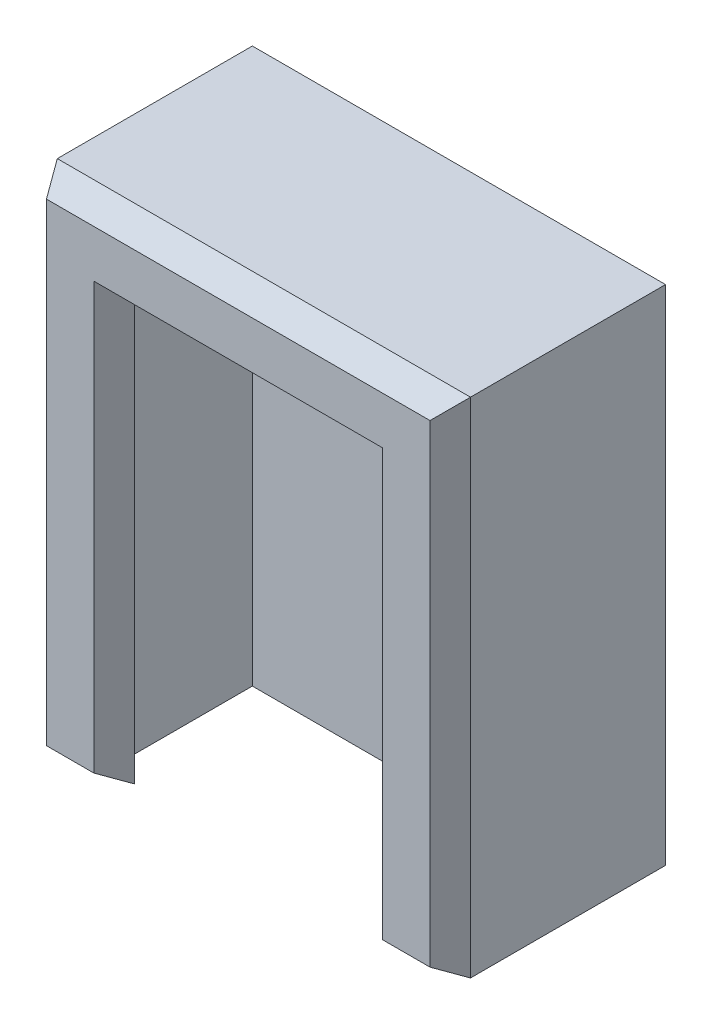
ISO-10303-21;
HEADER;
FILE_DESCRIPTION(('STEP AP214'),'2;1');
FILE_NAME('part.step','',(''),(''),'','','');
FILE_SCHEMA(('AUTOMOTIVE_DESIGN { 1 0 10303 214 1 1 1 1 }'));
ENDSEC;
DATA;
#1=APPLICATION_CONTEXT('core data for automotive mechanical design processes');
#2=APPLICATION_PROTOCOL_DEFINITION('international standard','automotive_design',2000,#1);
#3=PRODUCT_CONTEXT('',#1,'mechanical');
#4=PRODUCT('Part','Part','',(#3));
#5=PRODUCT_RELATED_PRODUCT_CATEGORY('part','',(#4));
#6=PRODUCT_DEFINITION_FORMATION('','',#4);
#7=PRODUCT_DEFINITION_CONTEXT('part definition',#1,'design');
#8=PRODUCT_DEFINITION('design','',#6,#7);
#9=PRODUCT_DEFINITION_SHAPE('','',#8);
#10=(LENGTH_UNIT() NAMED_UNIT(*) SI_UNIT(.MILLI.,.METRE.));
#11=(NAMED_UNIT(*) PLANE_ANGLE_UNIT() SI_UNIT($,.RADIAN.));
#12=(NAMED_UNIT(*) SI_UNIT($,.STERADIAN.) SOLID_ANGLE_UNIT());
#13=UNCERTAINTY_MEASURE_WITH_UNIT(LENGTH_MEASURE(1.E-05),#10,'distance_accuracy_value','');
#14=(GEOMETRIC_REPRESENTATION_CONTEXT(3) GLOBAL_UNCERTAINTY_ASSIGNED_CONTEXT((#13)) GLOBAL_UNIT_ASSIGNED_CONTEXT((#10,
#11,#12)) REPRESENTATION_CONTEXT('',''));
#15=CARTESIAN_POINT('',(0.,0.,0.));
#16=DIRECTION('',(0.,0.,1.));
#17=DIRECTION('',(1.,0.,0.));
#18=AXIS2_PLACEMENT_3D('',#15,#16,#17);
#19=CARTESIAN_POINT('',(0.,17.6,5.6));
#20=DIRECTION('',(0.,-1.,0.));
#21=DIRECTION('',(0.,0.,-1.));
#22=AXIS2_PLACEMENT_3D('',#19,#20,#21);
#23=PLANE('',#22);
#24=DIRECTION('',(0.,0.,-1.));
#25=VECTOR('',#24,1.);
#26=CARTESIAN_POINT('',(2.,17.6,5.6));
#27=LINE('',#26,#25);
#28=CARTESIAN_POINT('',(2.,17.6,5.6));
#29=VERTEX_POINT('',#28);
#30=CARTESIAN_POINT('',(2.,17.6,-2.));
#31=VERTEX_POINT('',#30);
#32=EDGE_CURVE('E106',#29,#31,#27,.T.);
#33=ORIENTED_EDGE('',*,*,#32,.T.);
#34=DIRECTION('',(-1.,0.,0.));
#35=VECTOR('',#34,1.);
#36=CARTESIAN_POINT('',(0.,17.6,-2.));
#37=LINE('',#36,#35);
#38=CARTESIAN_POINT('',(-14.1,17.6,-2.));
#39=VERTEX_POINT('',#38);
#40=EDGE_CURVE('E156',#31,#39,#37,.T.);
#41=ORIENTED_EDGE('',*,*,#40,.T.);
#42=DIRECTION('',(0.,0.,-1.));
#43=VECTOR('',#42,1.);
#44=CARTESIAN_POINT('',(-14.1,17.6,5.6));
#45=LINE('',#44,#43);
#46=CARTESIAN_POINT('',(-14.1,17.6,5.6));
#47=VERTEX_POINT('',#46);
#48=EDGE_CURVE('E11',#47,#39,#45,.T.);
#49=ORIENTED_EDGE('',*,*,#48,.F.);
#50=DIRECTION('',(-1.,0.,0.));
#51=VECTOR('',#50,1.);
#52=CARTESIAN_POINT('',(0.,17.6,5.6));
#53=LINE('',#52,#51);
#54=EDGE_CURVE('E98',#29,#47,#53,.T.);
#55=ORIENTED_EDGE('',*,*,#54,.F.);
#56=EDGE_LOOP('',(#33,#41,#49,#55));
#57=FACE_BOUND('',#56,.T.);
#58=ADVANCED_FACE('F41',(#57),#23,.F.);
#59=CARTESIAN_POINT('',(-14.1,0.,5.6));
#60=DIRECTION('',(1.,0.,0.));
#61=DIRECTION('',(0.,0.,-1.));
#62=AXIS2_PLACEMENT_3D('',#59,#60,#61);
#63=PLANE('',#62);
#64=ORIENTED_EDGE('',*,*,#48,.T.);
#65=DIRECTION('',(0.,-1.,0.));
#66=VECTOR('',#65,1.);
#67=CARTESIAN_POINT('',(-14.1,0.,-2.));
#68=LINE('',#67,#66);
#69=CARTESIAN_POINT('',(-14.1,-2.,-2.));
#70=VERTEX_POINT('',#69);
#71=EDGE_CURVE('E147',#39,#70,#68,.T.);
#72=ORIENTED_EDGE('',*,*,#71,.T.);
#73=DIRECTION('',(0.,0.,-1.));
#74=VECTOR('',#73,1.);
#75=CARTESIAN_POINT('',(-14.1,-2.,5.6));
#76=LINE('',#75,#74);
#77=CARTESIAN_POINT('',(-14.1,-2.,5.6));
#78=VERTEX_POINT('',#77);
#79=EDGE_CURVE('E50',#78,#70,#76,.T.);
#80=ORIENTED_EDGE('',*,*,#79,.F.);
#81=DIRECTION('',(0.,-1.,0.));
#82=VECTOR('',#81,1.);
#83=CARTESIAN_POINT('',(-14.1,0.,5.6));
#84=LINE('',#83,#82);
#85=EDGE_CURVE('E102',#47,#78,#84,.T.);
#86=ORIENTED_EDGE('',*,*,#85,.F.);
#87=EDGE_LOOP('',(#64,#72,#80,#86));
#88=FACE_BOUND('',#87,.T.);
#89=ADVANCED_FACE('F152',(#88),#63,.F.);
#90=CARTESIAN_POINT('',(-12.1,0.,5.6));
#91=DIRECTION('',(1.,0.,0.));
#92=DIRECTION('',(0.,0.,-1.));
#93=AXIS2_PLACEMENT_3D('',#90,#91,#92);
#94=PLANE('',#93);
#95=DIRECTION('',(0.,-1.,0.));
#96=VECTOR('',#95,1.);
#97=CARTESIAN_POINT('',(-12.1,0.,0.));
#98=LINE('',#97,#96);
#99=CARTESIAN_POINT('',(-12.1,15.6,0.));
#100=VERTEX_POINT('',#99);
#101=CARTESIAN_POINT('',(-12.1,-2.,0.));
#102=VERTEX_POINT('',#101);
#103=EDGE_CURVE('E92',#100,#102,#98,.T.);
#104=ORIENTED_EDGE('',*,*,#103,.F.);
#105=DIRECTION('',(0.,0.,-1.));
#106=VECTOR('',#105,1.);
#107=CARTESIAN_POINT('',(-12.1,15.6,5.6));
#108=LINE('',#107,#106);
#109=CARTESIAN_POINT('',(-12.1,15.6,5.6));
#110=VERTEX_POINT('',#109);
#111=EDGE_CURVE('E81',#110,#100,#108,.T.);
#112=ORIENTED_EDGE('',*,*,#111,.F.);
#113=DIRECTION('',(0.,-1.,0.));
#114=VECTOR('',#113,1.);
#115=CARTESIAN_POINT('',(-12.1,0.,5.6));
#116=LINE('',#115,#114);
#117=CARTESIAN_POINT('',(-12.1,-2.,5.6));
#118=VERTEX_POINT('',#117);
#119=EDGE_CURVE('E171',#110,#118,#116,.T.);
#120=ORIENTED_EDGE('',*,*,#119,.T.);
#121=DIRECTION('',(0.,0.,-1.));
#122=VECTOR('',#121,1.);
#123=CARTESIAN_POINT('',(-12.1,-2.,5.6));
#124=LINE('',#123,#122);
#125=EDGE_CURVE('E119',#118,#102,#124,.T.);
#126=ORIENTED_EDGE('',*,*,#125,.T.);
#127=EDGE_LOOP('',(#104,#112,#120,#126));
#128=FACE_BOUND('',#127,.T.);
#129=ADVANCED_FACE('F299',(#128),#94,.T.);
#130=CARTESIAN_POINT('',(0.,15.6,5.6));
#131=DIRECTION('',(0.,-1.,0.));
#132=DIRECTION('',(1.,0.,0.));
#133=AXIS2_PLACEMENT_3D('',#130,#131,#132);
#134=PLANE('',#133);
#135=DIRECTION('',(-1.,0.,0.));
#136=VECTOR('',#135,1.);
#137=CARTESIAN_POINT('',(0.,15.6,0.));
#138=LINE('',#137,#136);
#139=CARTESIAN_POINT('',(0.,15.6,0.));
#140=VERTEX_POINT('',#139);
#141=EDGE_CURVE('E85',#140,#100,#138,.T.);
#142=ORIENTED_EDGE('',*,*,#141,.F.);
#143=DIRECTION('',(0.,0.,-1.));
#144=VECTOR('',#143,1.);
#145=CARTESIAN_POINT('',(0.,15.6,5.6));
#146=LINE('',#145,#144);
#147=CARTESIAN_POINT('',(0.,15.6,5.6));
#148=VERTEX_POINT('',#147);
#149=EDGE_CURVE('E71',#148,#140,#146,.T.);
#150=ORIENTED_EDGE('',*,*,#149,.F.);
#151=DIRECTION('',(-1.,0.,0.));
#152=VECTOR('',#151,1.);
#153=CARTESIAN_POINT('',(0.,15.6,5.6));
#154=LINE('',#153,#152);
#155=EDGE_CURVE('E57',#148,#110,#154,.T.);
#156=ORIENTED_EDGE('',*,*,#155,.T.);
#157=ORIENTED_EDGE('',*,*,#111,.T.);
#158=EDGE_LOOP('',(#142,#150,#156,#157));
#159=FACE_BOUND('',#158,.T.);
#160=ADVANCED_FACE('F86',(#159),#134,.T.);
#161=CARTESIAN_POINT('',(0.,0.,5.6));
#162=DIRECTION('',(-1.,0.,0.));
#163=DIRECTION('',(0.,0.,1.));
#164=AXIS2_PLACEMENT_3D('',#161,#162,#163);
#165=PLANE('',#164);
#166=DIRECTION('',(0.,1.,0.));
#167=VECTOR('',#166,1.);
#168=CARTESIAN_POINT('',(0.,0.,0.));
#169=LINE('',#168,#167);
#170=CARTESIAN_POINT('',(0.,-2.,0.));
#171=VERTEX_POINT('',#170);
#172=EDGE_CURVE('E76',#171,#140,#169,.T.);
#173=ORIENTED_EDGE('',*,*,#172,.F.);
#174=DIRECTION('',(0.,0.,-1.));
#175=VECTOR('',#174,1.);
#176=CARTESIAN_POINT('',(0.,-2.,5.6));
#177=LINE('',#176,#175);
#178=CARTESIAN_POINT('',(0.,-2.,5.6));
#179=VERTEX_POINT('',#178);
#180=EDGE_CURVE('E82',#179,#171,#177,.T.);
#181=ORIENTED_EDGE('',*,*,#180,.F.);
#182=DIRECTION('',(0.,1.,0.));
#183=VECTOR('',#182,1.);
#184=CARTESIAN_POINT('',(0.,0.,5.6));
#185=LINE('',#184,#183);
#186=EDGE_CURVE('E78',#179,#148,#185,.T.);
#187=ORIENTED_EDGE('',*,*,#186,.T.);
#188=ORIENTED_EDGE('',*,*,#149,.T.);
#189=EDGE_LOOP('',(#173,#181,#187,#188));
#190=FACE_BOUND('',#189,.T.);
#191=ADVANCED_FACE('F73',(#190),#165,.T.);
#192=CARTESIAN_POINT('',(0.,-2.,5.6));
#193=DIRECTION('',(0.,1.,0.));
#194=DIRECTION('',(0.,0.,1.));
#195=AXIS2_PLACEMENT_3D('',#192,#193,#194);
#196=PLANE('',#195);
#197=ORIENTED_EDGE('',*,*,#180,.T.);
#198=DIRECTION('',(1.,0.,0.));
#199=VECTOR('',#198,1.);
#200=CARTESIAN_POINT('',(0.,-2.,0.));
#201=LINE('',#200,#199);
#202=EDGE_CURVE('E96',#102,#171,#201,.T.);
#203=ORIENTED_EDGE('',*,*,#202,.F.);
#204=ORIENTED_EDGE('',*,*,#125,.F.);
#205=DIRECTION('',(1.,0.,0.));
#206=VECTOR('',#205,1.);
#207=CARTESIAN_POINT('',(0.,-2.,5.6));
#208=LINE('',#207,#206);
#209=EDGE_CURVE('E137',#78,#118,#208,.T.);
#210=ORIENTED_EDGE('',*,*,#209,.F.);
#211=ORIENTED_EDGE('',*,*,#79,.T.);
#212=DIRECTION('',(1.,0.,0.));
#213=VECTOR('',#212,1.);
#214=CARTESIAN_POINT('',(0.,-2.,-2.));
#215=LINE('',#214,#213);
#216=CARTESIAN_POINT('',(2.,-2.,-2.));
#217=VERTEX_POINT('',#216);
#218=EDGE_CURVE('E133',#70,#217,#215,.T.);
#219=ORIENTED_EDGE('',*,*,#218,.T.);
#220=DIRECTION('',(0.,0.,-1.));
#221=VECTOR('',#220,1.);
#222=CARTESIAN_POINT('',(2.,-2.,5.6));
#223=LINE('',#222,#221);
#224=CARTESIAN_POINT('',(2.,-2.,5.6));
#225=VERTEX_POINT('',#224);
#226=EDGE_CURVE('E110',#225,#217,#223,.T.);
#227=ORIENTED_EDGE('',*,*,#226,.F.);
#228=EDGE_CURVE('E172',#179,#225,#208,.T.);
#229=ORIENTED_EDGE('',*,*,#228,.F.);
#230=EDGE_LOOP('',(#197,#203,#204,#210,#211,#219,#227,#229));
#231=FACE_BOUND('',#230,.T.);
#232=ADVANCED_FACE('F130',(#231),#196,.F.);
#233=CARTESIAN_POINT('',(2.,0.,5.6));
#234=DIRECTION('',(-1.,0.,0.));
#235=DIRECTION('',(0.,0.,1.));
#236=AXIS2_PLACEMENT_3D('',#233,#234,#235);
#237=PLANE('',#236);
#238=ORIENTED_EDGE('',*,*,#226,.T.);
#239=DIRECTION('',(0.,1.,0.));
#240=VECTOR('',#239,1.);
#241=CARTESIAN_POINT('',(2.,0.,-2.));
#242=LINE('',#241,#240);
#243=EDGE_CURVE('E149',#217,#31,#242,.T.);
#244=ORIENTED_EDGE('',*,*,#243,.T.);
#245=ORIENTED_EDGE('',*,*,#32,.F.);
#246=DIRECTION('',(0.,1.,0.));
#247=VECTOR('',#246,1.);
#248=CARTESIAN_POINT('',(2.,0.,5.6));
#249=LINE('',#248,#247);
#250=EDGE_CURVE('E111',#225,#29,#249,.T.);
#251=ORIENTED_EDGE('',*,*,#250,.F.);
#252=EDGE_LOOP('',(#238,#244,#245,#251));
#253=FACE_BOUND('',#252,.T.);
#254=ADVANCED_FACE('F215',(#253),#237,.F.);
#255=CARTESIAN_POINT('',(0.,0.,-2.));
#256=DIRECTION('',(0.,0.,1.));
#257=DIRECTION('',(1.,0.,0.));
#258=AXIS2_PLACEMENT_3D('',#255,#256,#257);
#259=PLANE('',#258);
#260=ORIENTED_EDGE('',*,*,#218,.F.);
#261=ORIENTED_EDGE('',*,*,#71,.F.);
#262=ORIENTED_EDGE('',*,*,#40,.F.);
#263=ORIENTED_EDGE('',*,*,#243,.F.);
#264=EDGE_LOOP('',(#260,#261,#262,#263));
#265=FACE_BOUND('',#264,.T.);
#266=ADVANCED_FACE('F145',(#265),#259,.F.);
#267=CARTESIAN_POINT('',(0.,0.,0.));
#268=DIRECTION('',(0.,0.,1.));
#269=DIRECTION('',(1.,0.,0.));
#270=AXIS2_PLACEMENT_3D('',#267,#268,#269);
#271=PLANE('',#270);
#272=ORIENTED_EDGE('',*,*,#202,.T.);
#273=ORIENTED_EDGE('',*,*,#172,.T.);
#274=ORIENTED_EDGE('',*,*,#141,.T.);
#275=ORIENTED_EDGE('',*,*,#103,.T.);
#276=EDGE_LOOP('',(#272,#273,#274,#275));
#277=FACE_BOUND('',#276,.T.);
#278=ADVANCED_FACE('F94',(#277),#271,.T.);
#279=CARTESIAN_POINT('',(2.,0.,5.6));
#280=DIRECTION('',(0.866025403784438,0.,0.5));
#281=DIRECTION('',(0.5,0.,-0.866025403784438));
#282=AXIS2_PLACEMENT_3D('',#279,#280,#281);
#283=PLANE('',#282);
#284=ORIENTED_EDGE('',*,*,#250,.T.);
#285=DIRECTION('',(0.447213595499958,0.447213595499958,-0.774596669241483));
#286=VECTOR('',#285,1.);
#287=CARTESIAN_POINT('',(1.6,17.2,6.29282032302755));
#288=LINE('',#287,#286);
#289=CARTESIAN_POINT('',(1.42264973081037,17.0226497308104,6.6));
#290=VERTEX_POINT('',#289);
#291=EDGE_CURVE('E164',#290,#29,#288,.T.);
#292=ORIENTED_EDGE('',*,*,#291,.F.);
#293=DIRECTION('',(0.,-1.,0.));
#294=VECTOR('',#293,1.);
#295=CARTESIAN_POINT('',(1.42264973081037,0.,6.6));
#296=LINE('',#295,#294);
#297=CARTESIAN_POINT('',(1.42264973081037,-1.42264973081037,6.6));
#298=VERTEX_POINT('',#297);
#299=EDGE_CURVE('E209',#298,#290,#296,.F.);
#300=ORIENTED_EDGE('',*,*,#299,.F.);
#301=DIRECTION('',(0.447213595499958,-0.447213595499958,-0.774596669241483));
#302=VECTOR('',#301,1.);
#303=CARTESIAN_POINT('',(1.6,-1.6,6.29282032302755));
#304=LINE('',#303,#302);
#305=EDGE_CURVE('E198',#298,#225,#304,.T.);
#306=ORIENTED_EDGE('',*,*,#305,.T.);
#307=EDGE_LOOP('',(#284,#292,#300,#306));
#308=FACE_BOUND('',#307,.T.);
#309=ADVANCED_FACE('F207',(#308),#283,.T.);
#310=CARTESIAN_POINT('',(0.,17.6,5.6));
#311=DIRECTION('',(0.,0.866025403784438,0.5));
#312=DIRECTION('',(0.,-0.5,0.866025403784438));
#313=AXIS2_PLACEMENT_3D('',#310,#311,#312);
#314=PLANE('',#313);
#315=ORIENTED_EDGE('',*,*,#54,.T.);
#316=DIRECTION('',(-0.447213595499958,0.447213595499958,-0.774596669241483));
#317=VECTOR('',#316,1.);
#318=CARTESIAN_POINT('',(-10.58,14.08,11.6968188426425));
#319=LINE('',#318,#317);
#320=CARTESIAN_POINT('',(-13.5226497308104,17.0226497308104,6.6));
#321=VERTEX_POINT('',#320);
#322=EDGE_CURVE('E228',#321,#47,#319,.T.);
#323=ORIENTED_EDGE('',*,*,#322,.F.);
#324=DIRECTION('',(1.,0.,0.));
#325=VECTOR('',#324,1.);
#326=CARTESIAN_POINT('',(0.,17.0226497308104,6.6));
#327=LINE('',#326,#325);
#328=EDGE_CURVE('E249',#290,#321,#327,.F.);
#329=ORIENTED_EDGE('',*,*,#328,.F.);
#330=ORIENTED_EDGE('',*,*,#291,.T.);
#331=EDGE_LOOP('',(#315,#323,#329,#330));
#332=FACE_BOUND('',#331,.T.);
#333=ADVANCED_FACE('F225',(#332),#314,.T.);
#334=CARTESIAN_POINT('',(-14.1,0.,5.6));
#335=DIRECTION('',(-0.866025403784438,0.,0.5));
#336=DIRECTION('',(0.5,0.,0.866025403784438));
#337=AXIS2_PLACEMENT_3D('',#334,#335,#336);
#338=PLANE('',#337);
#339=ORIENTED_EDGE('',*,*,#85,.T.);
#340=DIRECTION('',(-0.447213595499958,-0.447213595499958,-0.774596669241483));
#341=VECTOR('',#340,1.);
#342=CARTESIAN_POINT('',(-11.28,0.820000000000003,10.4843832773442));
#343=LINE('',#342,#341);
#344=CARTESIAN_POINT('',(-13.5226497308104,-1.42264973081037,6.6));
#345=VERTEX_POINT('',#344);
#346=EDGE_CURVE('E238',#345,#78,#343,.T.);
#347=ORIENTED_EDGE('',*,*,#346,.F.);
#348=DIRECTION('',(0.,1.,0.));
#349=VECTOR('',#348,1.);
#350=CARTESIAN_POINT('',(-13.5226497308104,0.,6.6));
#351=LINE('',#350,#349);
#352=EDGE_CURVE('E236',#321,#345,#351,.F.);
#353=ORIENTED_EDGE('',*,*,#352,.F.);
#354=ORIENTED_EDGE('',*,*,#322,.T.);
#355=EDGE_LOOP('',(#339,#347,#353,#354));
#356=FACE_BOUND('',#355,.T.);
#357=ADVANCED_FACE('F232',(#356),#338,.T.);
#358=CARTESIAN_POINT('',(0.,-2.,5.6));
#359=DIRECTION('',(0.,-0.866025403784438,0.5));
#360=DIRECTION('',(0.,-0.5,-0.866025403784438));
#361=AXIS2_PLACEMENT_3D('',#358,#359,#360);
#362=PLANE('',#361);
#363=ORIENTED_EDGE('',*,*,#209,.T.);
#364=DIRECTION('',(1.,0.,0.));
#365=VECTOR('',#364,1.);
#366=CARTESIAN_POINT('',(0.,-2.,5.6));
#367=LINE('',#366,#365);
#368=CARTESIAN_POINT('',(-11.1,-2.,5.6));
#369=VERTEX_POINT('',#368);
#370=EDGE_CURVE('E297',#118,#369,#367,.T.);
#371=ORIENTED_EDGE('',*,*,#370,.T.);
#372=DIRECTION('',(-0.447213595499958,0.447213595499958,0.774596669241483));
#373=VECTOR('',#372,1.);
#374=CARTESIAN_POINT('',(-8.88,-4.22,1.75484720719709));
#375=LINE('',#374,#373);
#376=CARTESIAN_POINT('',(-11.6773502691896,-1.42264973081037,6.6));
#377=VERTEX_POINT('',#376);
#378=EDGE_CURVE('E243',#377,#369,#375,.F.);
#379=ORIENTED_EDGE('',*,*,#378,.F.);
#380=DIRECTION('',(-1.,0.,0.));
#381=VECTOR('',#380,1.);
#382=CARTESIAN_POINT('',(0.,-1.42264973081037,6.6));
#383=LINE('',#382,#381);
#384=EDGE_CURVE('E255',#345,#377,#383,.F.);
#385=ORIENTED_EDGE('',*,*,#384,.F.);
#386=ORIENTED_EDGE('',*,*,#346,.T.);
#387=EDGE_LOOP('',(#363,#371,#379,#385,#386));
#388=FACE_BOUND('',#387,.T.);
#389=ADVANCED_FACE('F384',(#388),#362,.T.);
#390=CARTESIAN_POINT('',(-11.1,0.,5.6));
#391=DIRECTION('',(0.866025403784438,0.,0.5));
#392=DIRECTION('',(0.5,0.,-0.866025403784438));
#393=AXIS2_PLACEMENT_3D('',#390,#391,#392);
#394=PLANE('',#393);
#395=DIRECTION('',(0.,-1.,0.));
#396=VECTOR('',#395,1.);
#397=CARTESIAN_POINT('',(-11.1,0.,5.6));
#398=LINE('',#397,#396);
#399=CARTESIAN_POINT('',(-11.1,14.6,5.6));
#400=VERTEX_POINT('',#399);
#401=EDGE_CURVE('E497',#400,#369,#398,.T.);
#402=ORIENTED_EDGE('',*,*,#401,.F.);
#403=DIRECTION('',(-0.447213595499958,0.447213595499958,0.774596669241483));
#404=VECTOR('',#403,1.);
#405=CARTESIAN_POINT('',(-8.88,12.38,1.75484720719709));
#406=LINE('',#405,#404);
#407=CARTESIAN_POINT('',(-11.6773502691896,15.1773502691896,6.6));
#408=VERTEX_POINT('',#407);
#409=EDGE_CURVE('E505',#408,#400,#406,.F.);
#410=ORIENTED_EDGE('',*,*,#409,.F.);
#411=DIRECTION('',(0.,-1.,0.));
#412=VECTOR('',#411,1.);
#413=CARTESIAN_POINT('',(-11.6773502691896,0.,6.6));
#414=LINE('',#413,#412);
#415=EDGE_CURVE('E259',#408,#377,#414,.T.);
#416=ORIENTED_EDGE('',*,*,#415,.T.);
#417=ORIENTED_EDGE('',*,*,#378,.T.);
#418=EDGE_LOOP('',(#402,#410,#416,#417));
#419=FACE_BOUND('',#418,.T.);
#420=ADVANCED_FACE('F394',(#419),#394,.T.);
#421=CARTESIAN_POINT('',(0.,14.6,5.6));
#422=DIRECTION('',(0.,-0.866025403784438,0.5));
#423=DIRECTION('',(0.,-0.5,-0.866025403784438));
#424=AXIS2_PLACEMENT_3D('',#421,#422,#423);
#425=PLANE('',#424);
#426=DIRECTION('',(1.,0.,0.));
#427=VECTOR('',#426,1.);
#428=CARTESIAN_POINT('',(0.,14.6,5.6));
#429=LINE('',#428,#427);
#430=CARTESIAN_POINT('',(-0.999999999999999,14.6,5.6));
#431=VERTEX_POINT('',#430);
#432=EDGE_CURVE('E491',#400,#431,#429,.T.);
#433=ORIENTED_EDGE('',*,*,#432,.T.);
#434=DIRECTION('',(-0.447213595499958,-0.447213595499958,-0.774596669241483));
#435=VECTOR('',#434,1.);
#436=CARTESIAN_POINT('',(-0.799999999999999,14.8,5.94641016151378));
#437=LINE('',#436,#435);
#438=CARTESIAN_POINT('',(-0.422649730810373,15.1773502691896,6.6));
#439=VERTEX_POINT('',#438);
#440=EDGE_CURVE('E487',#439,#431,#437,.T.);
#441=ORIENTED_EDGE('',*,*,#440,.F.);
#442=DIRECTION('',(-1.,0.,0.));
#443=VECTOR('',#442,1.);
#444=CARTESIAN_POINT('',(0.,15.1773502691896,6.6));
#445=LINE('',#444,#443);
#446=EDGE_CURVE('E263',#408,#439,#445,.F.);
#447=ORIENTED_EDGE('',*,*,#446,.F.);
#448=ORIENTED_EDGE('',*,*,#409,.T.);
#449=EDGE_LOOP('',(#433,#441,#447,#448));
#450=FACE_BOUND('',#449,.T.);
#451=ADVANCED_FACE('F404',(#450),#425,.T.);
#452=CARTESIAN_POINT('',(-1.,0.,5.6));
#453=DIRECTION('',(-0.866025403784438,0.,0.5));
#454=DIRECTION('',(0.5,0.,0.866025403784438));
#455=AXIS2_PLACEMENT_3D('',#452,#453,#454);
#456=PLANE('',#455);
#457=DIRECTION('',(0.,-1.,0.));
#458=VECTOR('',#457,1.);
#459=CARTESIAN_POINT('',(-1.,0.,5.6));
#460=LINE('',#459,#458);
#461=CARTESIAN_POINT('',(-1.,-2.,5.6));
#462=VERTEX_POINT('',#461);
#463=EDGE_CURVE('E484',#431,#462,#460,.T.);
#464=ORIENTED_EDGE('',*,*,#463,.T.);
#465=DIRECTION('',(-0.447213595499958,-0.447213595499958,-0.774596669241483));
#466=VECTOR('',#465,1.);
#467=CARTESIAN_POINT('',(-0.8,-1.8,5.94641016151378));
#468=LINE('',#467,#466);
#469=CARTESIAN_POINT('',(-0.422649730810374,-1.42264973081037,6.6));
#470=VERTEX_POINT('',#469);
#471=EDGE_CURVE('E211',#470,#462,#468,.T.);
#472=ORIENTED_EDGE('',*,*,#471,.F.);
#473=DIRECTION('',(0.,1.,0.));
#474=VECTOR('',#473,1.);
#475=CARTESIAN_POINT('',(-0.422649730810374,0.,6.6));
#476=LINE('',#475,#474);
#477=EDGE_CURVE('E267',#439,#470,#476,.F.);
#478=ORIENTED_EDGE('',*,*,#477,.F.);
#479=ORIENTED_EDGE('',*,*,#440,.T.);
#480=EDGE_LOOP('',(#464,#472,#478,#479));
#481=FACE_BOUND('',#480,.T.);
#482=ADVANCED_FACE('F414',(#481),#456,.T.);
#483=CARTESIAN_POINT('',(0.,-2.,5.6));
#484=DIRECTION('',(0.,-0.866025403784438,0.5));
#485=DIRECTION('',(0.,-0.5,-0.866025403784438));
#486=AXIS2_PLACEMENT_3D('',#483,#484,#485);
#487=PLANE('',#486);
#488=DIRECTION('',(1.,0.,0.));
#489=VECTOR('',#488,1.);
#490=CARTESIAN_POINT('',(0.,-2.,5.6));
#491=LINE('',#490,#489);
#492=EDGE_CURVE('E203',#462,#179,#491,.T.);
#493=ORIENTED_EDGE('',*,*,#492,.T.);
#494=ORIENTED_EDGE('',*,*,#228,.T.);
#495=ORIENTED_EDGE('',*,*,#305,.F.);
#496=DIRECTION('',(-1.,0.,0.));
#497=VECTOR('',#496,1.);
#498=CARTESIAN_POINT('',(0.,-1.42264973081037,6.6));
#499=LINE('',#498,#497);
#500=EDGE_CURVE('E212',#470,#298,#499,.F.);
#501=ORIENTED_EDGE('',*,*,#500,.F.);
#502=ORIENTED_EDGE('',*,*,#471,.T.);
#503=EDGE_LOOP('',(#493,#494,#495,#501,#502));
#504=FACE_BOUND('',#503,.T.);
#505=ADVANCED_FACE('F195',(#504),#487,.T.);
#506=CARTESIAN_POINT('',(0.,0.,6.6));
#507=DIRECTION('',(0.,0.,1.));
#508=DIRECTION('',(1.,0.,0.));
#509=AXIS2_PLACEMENT_3D('',#506,#507,#508);
#510=PLANE('',#509);
#511=ORIENTED_EDGE('',*,*,#299,.T.);
#512=ORIENTED_EDGE('',*,*,#328,.T.);
#513=ORIENTED_EDGE('',*,*,#352,.T.);
#514=ORIENTED_EDGE('',*,*,#384,.T.);
#515=ORIENTED_EDGE('',*,*,#415,.F.);
#516=ORIENTED_EDGE('',*,*,#446,.T.);
#517=ORIENTED_EDGE('',*,*,#477,.T.);
#518=ORIENTED_EDGE('',*,*,#500,.T.);
#519=EDGE_LOOP('',(#511,#512,#513,#514,#515,#516,#517,#518));
#520=FACE_BOUND('',#519,.T.);
#521=ADVANCED_FACE('F275',(#520),#510,.T.);
#522=CARTESIAN_POINT('',(0.,0.,5.6));
#523=DIRECTION('',(0.,0.,1.));
#524=DIRECTION('',(1.,0.,0.));
#525=AXIS2_PLACEMENT_3D('',#522,#523,#524);
#526=PLANE('',#525);
#527=ORIENTED_EDGE('',*,*,#119,.F.);
#528=ORIENTED_EDGE('',*,*,#155,.F.);
#529=ORIENTED_EDGE('',*,*,#186,.F.);
#530=ORIENTED_EDGE('',*,*,#492,.F.);
#531=ORIENTED_EDGE('',*,*,#463,.F.);
#532=ORIENTED_EDGE('',*,*,#432,.F.);
#533=ORIENTED_EDGE('',*,*,#401,.T.);
#534=ORIENTED_EDGE('',*,*,#370,.F.);
#535=EDGE_LOOP('',(#527,#528,#529,#530,#531,#532,#533,#534));
#536=FACE_BOUND('',#535,.T.);
#537=ADVANCED_FACE('F294',(#536),#526,.F.);
#538=CLOSED_SHELL('',(#58,#89,#129,#160,#191,#232,#254,#266,#278,#309,#333,#357,#389,#420,#451,
#482,#505,#521,#537));
#539=MANIFOLD_SOLID_BREP('B2',#538);
#540=ADVANCED_BREP_SHAPE_REPRESENTATION('',(#18,#539),#14);
#541=SHAPE_DEFINITION_REPRESENTATION(#9,#540);
ENDSEC;
END-ISO-10303-21;
